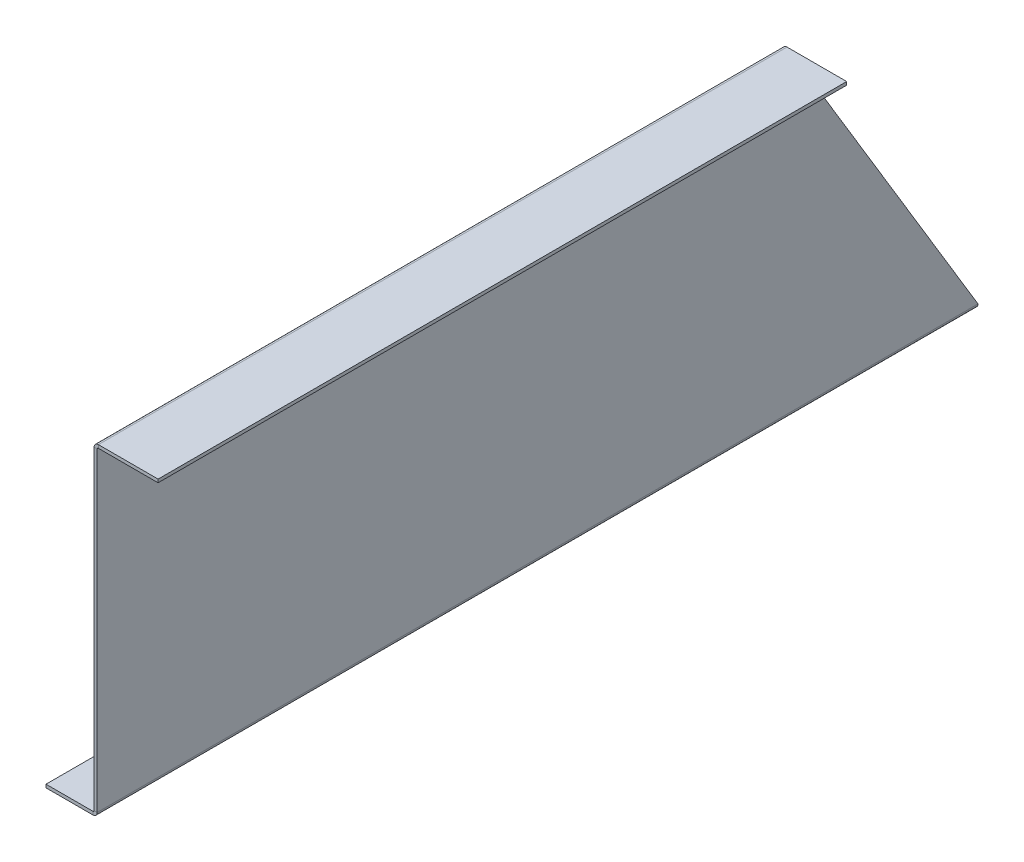
ISO-10303-21;
HEADER;
FILE_DESCRIPTION(('STEP AP214'),'2;1');
FILE_NAME('part.step','',(''),(''),'','','');
FILE_SCHEMA(('AUTOMOTIVE_DESIGN { 1 0 10303 214 1 1 1 1 }'));
ENDSEC;
DATA;
#1=APPLICATION_CONTEXT('core data for automotive mechanical design processes');
#2=APPLICATION_PROTOCOL_DEFINITION('international standard','automotive_design',2000,#1);
#3=PRODUCT_CONTEXT('',#1,'mechanical');
#4=PRODUCT('Part','Part','',(#3));
#5=PRODUCT_RELATED_PRODUCT_CATEGORY('part','',(#4));
#6=PRODUCT_DEFINITION_FORMATION('','',#4);
#7=PRODUCT_DEFINITION_CONTEXT('part definition',#1,'design');
#8=PRODUCT_DEFINITION('design','',#6,#7);
#9=PRODUCT_DEFINITION_SHAPE('','',#8);
#10=(LENGTH_UNIT() NAMED_UNIT(*) SI_UNIT(.MILLI.,.METRE.));
#11=(NAMED_UNIT(*) PLANE_ANGLE_UNIT() SI_UNIT($,.RADIAN.));
#12=(NAMED_UNIT(*) SI_UNIT($,.STERADIAN.) SOLID_ANGLE_UNIT());
#13=UNCERTAINTY_MEASURE_WITH_UNIT(LENGTH_MEASURE(1.E-05),#10,'distance_accuracy_value','');
#14=(GEOMETRIC_REPRESENTATION_CONTEXT(3) GLOBAL_UNCERTAINTY_ASSIGNED_CONTEXT((#13)) GLOBAL_UNIT_ASSIGNED_CONTEXT((#10,
#11,#12)) REPRESENTATION_CONTEXT('',''));
#15=CARTESIAN_POINT('',(0.,0.,0.));
#16=DIRECTION('',(0.,0.,1.));
#17=DIRECTION('',(1.,0.,0.));
#18=AXIS2_PLACEMENT_3D('',#15,#16,#17);
#19=CARTESIAN_POINT('',(29.2634,-2.,550.));
#20=DIRECTION('',(0.,0.,1.));
#21=DIRECTION('',(1.,0.,0.));
#22=AXIS2_PLACEMENT_3D('',#19,#20,#21);
#23=PLANE('',#22);
#24=DIRECTION('',(0.,1.,0.));
#25=VECTOR('',#24,1.);
#26=CARTESIAN_POINT('',(32.,0.,550.));
#27=LINE('',#26,#25);
#28=CARTESIAN_POINT('',(32.,0.7366,550.));
#29=VERTEX_POINT('',#28);
#30=CARTESIAN_POINT('',(32.,197.2634,550.));
#31=VERTEX_POINT('',#30);
#32=EDGE_CURVE('E253',#29,#31,#27,.T.);
#33=ORIENTED_EDGE('',*,*,#32,.T.);
#34=DIRECTION('',(-1.,0.,0.));
#35=VECTOR('',#34,1.);
#36=CARTESIAN_POINT('',(32.,197.2634,550.));
#37=LINE('',#36,#35);
#38=CARTESIAN_POINT('',(30.,197.2634,550.));
#39=VERTEX_POINT('',#38);
#40=EDGE_CURVE('E215',#31,#39,#37,.T.);
#41=ORIENTED_EDGE('',*,*,#40,.T.);
#42=DIRECTION('',(0.,1.,0.));
#43=VECTOR('',#42,1.);
#44=CARTESIAN_POINT('',(30.,0.,550.));
#45=LINE('',#44,#43);
#46=CARTESIAN_POINT('',(30.,0.7366,550.));
#47=VERTEX_POINT('',#46);
#48=EDGE_CURVE('E256',#47,#39,#45,.T.);
#49=ORIENTED_EDGE('',*,*,#48,.F.);
#50=DIRECTION('',(1.,0.,0.));
#51=VECTOR('',#50,1.);
#52=CARTESIAN_POINT('',(30.,0.7366,550.));
#53=LINE('',#52,#51);
#54=EDGE_CURVE('E311',#47,#29,#53,.T.);
#55=ORIENTED_EDGE('',*,*,#54,.T.);
#56=EDGE_LOOP('',(#33,#41,#49,#55));
#57=FACE_BOUND('',#56,.T.);
#58=ADVANCED_FACE('F59',(#57),#23,.T.);
#59=CARTESIAN_POINT('',(32.,0.,550.));
#60=DIRECTION('',(-1.,0.,0.));
#61=DIRECTION('',(0.,0.,1.));
#62=AXIS2_PLACEMENT_3D('',#59,#60,#61);
#63=PLANE('',#62);
#64=DIRECTION('',(0.,0.,1.));
#65=VECTOR('',#64,1.);
#66=CARTESIAN_POINT('',(32.,197.2634,550.));
#67=LINE('',#66,#65);
#68=CARTESIAN_POINT('',(32.,197.2634,120.));
#69=VERTEX_POINT('',#68);
#70=EDGE_CURVE('E221',#31,#69,#67,.F.);
#71=ORIENTED_EDGE('',*,*,#70,.F.);
#72=ORIENTED_EDGE('',*,*,#32,.F.);
#73=DIRECTION('',(0.,0.,-1.));
#74=VECTOR('',#73,1.);
#75=CARTESIAN_POINT('',(32.,0.7366,550.));
#76=LINE('',#75,#74);
#77=CARTESIAN_POINT('',(32.,0.7366,0.));
#78=VERTEX_POINT('',#77);
#79=EDGE_CURVE('E275',#29,#78,#76,.T.);
#80=ORIENTED_EDGE('',*,*,#79,.T.);
#81=DIRECTION('',(0.,-0.856653538721416,-0.515892154036165));
#82=VECTOR('',#81,1.);
#83=CARTESIAN_POINT('',(32.,0.7366,0.));
#84=LINE('',#83,#82);
#85=CARTESIAN_POINT('',(32.,198.339471666667,119.));
#86=VERTEX_POINT('',#85);
#87=EDGE_CURVE('E250',#86,#78,#84,.T.);
#88=ORIENTED_EDGE('',*,*,#87,.F.);
#89=DIRECTION('',(0.,1.,0.));
#90=VECTOR('',#89,1.);
#91=CARTESIAN_POINT('',(32.,196.2634,119.));
#92=LINE('',#91,#90);
#93=CARTESIAN_POINT('',(32.,196.2634,119.));
#94=VERTEX_POINT('',#93);
#95=EDGE_CURVE('E79',#94,#86,#92,.T.);
#96=ORIENTED_EDGE('',*,*,#95,.F.);
#97=DIRECTION('',(0.,0.,-1.));
#98=VECTOR('',#97,1.);
#99=CARTESIAN_POINT('',(32.,196.2634,120.));
#100=LINE('',#99,#98);
#101=CARTESIAN_POINT('',(32.,196.2634,120.));
#102=VERTEX_POINT('',#101);
#103=EDGE_CURVE('E74',#102,#94,#100,.T.);
#104=ORIENTED_EDGE('',*,*,#103,.F.);
#105=DIRECTION('',(0.,-1.,0.));
#106=VECTOR('',#105,1.);
#107=CARTESIAN_POINT('',(32.,197.2634,120.));
#108=LINE('',#107,#106);
#109=EDGE_CURVE('E232',#69,#102,#108,.T.);
#110=ORIENTED_EDGE('',*,*,#109,.F.);
#111=EDGE_LOOP('',(#71,#72,#80,#88,#96,#104,#110));
#112=FACE_BOUND('',#111,.T.);
#113=ADVANCED_FACE('F325',(#112),#63,.F.);
#114=CARTESIAN_POINT('',(30.,0.,550.));
#115=DIRECTION('',(-1.,0.,0.));
#116=DIRECTION('',(0.,0.,1.));
#117=AXIS2_PLACEMENT_3D('',#114,#115,#116);
#118=PLANE('',#117);
#119=ORIENTED_EDGE('',*,*,#48,.T.);
#120=DIRECTION('',(0.,0.,1.));
#121=VECTOR('',#120,1.);
#122=CARTESIAN_POINT('',(30.,197.2634,550.));
#123=LINE('',#122,#121);
#124=CARTESIAN_POINT('',(30.,197.2634,120.));
#125=VERTEX_POINT('',#124);
#126=EDGE_CURVE('E208',#39,#125,#123,.F.);
#127=ORIENTED_EDGE('',*,*,#126,.T.);
#128=DIRECTION('',(0.,-1.,0.));
#129=VECTOR('',#128,1.);
#130=CARTESIAN_POINT('',(30.,0.,120.));
#131=LINE('',#130,#129);
#132=CARTESIAN_POINT('',(30.,196.2634,120.));
#133=VERTEX_POINT('',#132);
#134=EDGE_CURVE('E13',#125,#133,#131,.T.);
#135=ORIENTED_EDGE('',*,*,#134,.T.);
#136=DIRECTION('',(0.,0.,-1.));
#137=VECTOR('',#136,1.);
#138=CARTESIAN_POINT('',(30.,196.2634,550.));
#139=LINE('',#138,#137);
#140=CARTESIAN_POINT('',(30.,196.2634,119.));
#141=VERTEX_POINT('',#140);
#142=EDGE_CURVE('E67',#133,#141,#139,.T.);
#143=ORIENTED_EDGE('',*,*,#142,.T.);
#144=DIRECTION('',(0.,1.,0.));
#145=VECTOR('',#144,1.);
#146=CARTESIAN_POINT('',(30.,0.,119.));
#147=LINE('',#146,#145);
#148=CARTESIAN_POINT('',(30.,198.339471666667,119.));
#149=VERTEX_POINT('',#148);
#150=EDGE_CURVE('E235',#141,#149,#147,.T.);
#151=ORIENTED_EDGE('',*,*,#150,.T.);
#152=DIRECTION('',(0.,-0.856653538721417,-0.515892154036165));
#153=VECTOR('',#152,1.);
#154=CARTESIAN_POINT('',(30.,0.7366,0.));
#155=LINE('',#154,#153);
#156=CARTESIAN_POINT('',(30.,0.7366,0.));
#157=VERTEX_POINT('',#156);
#158=EDGE_CURVE('E248',#149,#157,#155,.T.);
#159=ORIENTED_EDGE('',*,*,#158,.T.);
#160=DIRECTION('',(0.,0.,-1.));
#161=VECTOR('',#160,1.);
#162=CARTESIAN_POINT('',(30.,0.7366,550.));
#163=LINE('',#162,#161);
#164=EDGE_CURVE('E301',#47,#157,#163,.T.);
#165=ORIENTED_EDGE('',*,*,#164,.F.);
#166=EDGE_LOOP('',(#119,#127,#135,#143,#151,#159,#165));
#167=FACE_BOUND('',#166,.T.);
#168=ADVANCED_FACE('F315',(#167),#118,.T.);
#169=CARTESIAN_POINT('',(-0.001000000000001,0.7366,0.));
#170=DIRECTION('',(0.,-0.515892154036165,0.856653538721417));
#171=DIRECTION('',(0.,-0.856653538721417,-0.515892154036165));
#172=AXIS2_PLACEMENT_3D('',#169,#170,#171);
#173=PLANE('',#172);
#174=DIRECTION('',(-1.,0.,0.));
#175=VECTOR('',#174,1.);
#176=CARTESIAN_POINT('',(32.,198.339471666667,119.));
#177=LINE('',#176,#175);
#178=EDGE_CURVE('E239',#86,#149,#177,.T.);
#179=ORIENTED_EDGE('',*,*,#178,.F.);
#180=ORIENTED_EDGE('',*,*,#87,.T.);
#181=DIRECTION('',(-1.,0.,0.));
#182=VECTOR('',#181,1.);
#183=CARTESIAN_POINT('',(32.,0.7366,0.));
#184=LINE('',#183,#182);
#185=EDGE_CURVE('E304',#78,#157,#184,.T.);
#186=ORIENTED_EDGE('',*,*,#185,.T.);
#187=ORIENTED_EDGE('',*,*,#158,.F.);
#188=EDGE_LOOP('',(#179,#180,#186,#187));
#189=FACE_BOUND('',#188,.T.);
#190=ADVANCED_FACE('F341',(#189),#173,.F.);
#191=CARTESIAN_POINT('',(30.,0.7366,550.));
#192=DIRECTION('',(0.,0.,1.));
#193=DIRECTION('',(1.,0.,0.));
#194=AXIS2_PLACEMENT_3D('',#191,#192,#193);
#195=PLANE('',#194);
#196=ORIENTED_EDGE('',*,*,#54,.F.);
#197=CARTESIAN_POINT('',(29.2634,0.7366,550.));
#198=DIRECTION('',(0.,0.,-1.));
#199=DIRECTION('',(-1.,0.,0.));
#200=AXIS2_PLACEMENT_3D('',#197,#198,#199);
#201=CIRCLE('',#200,0.7366);
#202=CARTESIAN_POINT('',(29.2634,0.,550.));
#203=VERTEX_POINT('',#202);
#204=EDGE_CURVE('E260',#203,#47,#201,.F.);
#205=ORIENTED_EDGE('',*,*,#204,.F.);
#206=DIRECTION('',(0.,1.,0.));
#207=VECTOR('',#206,1.);
#208=CARTESIAN_POINT('',(29.2634,-2.,550.));
#209=LINE('',#208,#207);
#210=CARTESIAN_POINT('',(29.2634,-2.,550.));
#211=VERTEX_POINT('',#210);
#212=EDGE_CURVE('E309',#211,#203,#209,.T.);
#213=ORIENTED_EDGE('',*,*,#212,.F.);
#214=CARTESIAN_POINT('',(29.2634,0.7366,550.));
#215=DIRECTION('',(0.,0.,1.));
#216=DIRECTION('',(1.,0.,0.));
#217=AXIS2_PLACEMENT_3D('',#214,#215,#216);
#218=CIRCLE('',#217,2.7366);
#219=EDGE_CURVE('E272',#211,#29,#218,.T.);
#220=ORIENTED_EDGE('',*,*,#219,.T.);
#221=EDGE_LOOP('',(#196,#205,#213,#220));
#222=FACE_BOUND('',#221,.T.);
#223=ADVANCED_FACE('F61',(#222),#195,.T.);
#224=CARTESIAN_POINT('',(29.2634,0.,0.));
#225=DIRECTION('',(0.,0.,-1.));
#226=DIRECTION('',(-1.,0.,0.));
#227=AXIS2_PLACEMENT_3D('',#224,#225,#226);
#228=PLANE('',#227);
#229=DIRECTION('',(0.,-1.,0.));
#230=VECTOR('',#229,1.);
#231=CARTESIAN_POINT('',(29.2634,0.,0.));
#232=LINE('',#231,#230);
#233=CARTESIAN_POINT('',(29.2634,0.,0.));
#234=VERTEX_POINT('',#233);
#235=CARTESIAN_POINT('',(29.2634,-2.,0.));
#236=VERTEX_POINT('',#235);
#237=EDGE_CURVE('E307',#234,#236,#232,.T.);
#238=ORIENTED_EDGE('',*,*,#237,.F.);
#239=CARTESIAN_POINT('',(29.2634,0.7366,0.));
#240=DIRECTION('',(0.,0.,-1.));
#241=DIRECTION('',(-1.,0.,0.));
#242=AXIS2_PLACEMENT_3D('',#239,#240,#241);
#243=CIRCLE('',#242,0.7366);
#244=EDGE_CURVE('E252',#234,#157,#243,.F.);
#245=ORIENTED_EDGE('',*,*,#244,.T.);
#246=ORIENTED_EDGE('',*,*,#185,.F.);
#247=CARTESIAN_POINT('',(29.2634,0.7366,0.));
#248=DIRECTION('',(0.,0.,1.));
#249=DIRECTION('',(1.,0.,0.));
#250=AXIS2_PLACEMENT_3D('',#247,#248,#249);
#251=CIRCLE('',#250,2.7366);
#252=EDGE_CURVE('E257',#236,#78,#251,.T.);
#253=ORIENTED_EDGE('',*,*,#252,.F.);
#254=EDGE_LOOP('',(#238,#245,#246,#253));
#255=FACE_BOUND('',#254,.T.);
#256=ADVANCED_FACE('F343',(#255),#228,.T.);
#257=CARTESIAN_POINT('',(32.,0.7366,0.));
#258=DIRECTION('',(0.,0.,-1.));
#259=DIRECTION('',(-1.,0.,0.));
#260=AXIS2_PLACEMENT_3D('',#257,#258,#259);
#261=PLANE('',#260);
#262=DIRECTION('',(1.,0.,0.));
#263=VECTOR('',#262,1.);
#264=CARTESIAN_POINT('',(0.,0.,0.));
#265=LINE('',#264,#263);
#266=CARTESIAN_POINT('',(0.,0.,0.));
#267=VERTEX_POINT('',#266);
#268=EDGE_CURVE('E278',#267,#234,#265,.T.);
#269=ORIENTED_EDGE('',*,*,#268,.T.);
#270=ORIENTED_EDGE('',*,*,#237,.T.);
#271=DIRECTION('',(1.,0.,0.));
#272=VECTOR('',#271,1.);
#273=CARTESIAN_POINT('',(0.,-2.,0.));
#274=LINE('',#273,#272);
#275=CARTESIAN_POINT('',(0.,-2.,0.));
#276=VERTEX_POINT('',#275);
#277=EDGE_CURVE('E284',#276,#236,#274,.T.);
#278=ORIENTED_EDGE('',*,*,#277,.F.);
#279=DIRECTION('',(0.,1.,0.));
#280=VECTOR('',#279,1.);
#281=CARTESIAN_POINT('',(0.,-2.,0.));
#282=LINE('',#281,#280);
#283=EDGE_CURVE('E281',#276,#267,#282,.T.);
#284=ORIENTED_EDGE('',*,*,#283,.T.);
#285=EDGE_LOOP('',(#269,#270,#278,#284));
#286=FACE_BOUND('',#285,.T.);
#287=ADVANCED_FACE('F350',(#286),#261,.T.);
#288=CARTESIAN_POINT('',(29.2634,0.7366,550.));
#289=DIRECTION('',(0.,0.,-1.));
#290=DIRECTION('',(-1.,0.,0.));
#291=AXIS2_PLACEMENT_3D('',#288,#289,#290);
#292=CYLINDRICAL_SURFACE('',#291,0.7366);
#293=ORIENTED_EDGE('',*,*,#244,.F.);
#294=DIRECTION('',(0.,0.,-1.));
#295=VECTOR('',#294,1.);
#296=CARTESIAN_POINT('',(29.2634,0.,550.));
#297=LINE('',#296,#295);
#298=EDGE_CURVE('E298',#203,#234,#297,.T.);
#299=ORIENTED_EDGE('',*,*,#298,.F.);
#300=ORIENTED_EDGE('',*,*,#204,.T.);
#301=ORIENTED_EDGE('',*,*,#164,.T.);
#302=EDGE_LOOP('',(#293,#299,#300,#301));
#303=FACE_BOUND('',#302,.T.);
#304=ADVANCED_FACE('F347',(#303),#292,.F.);
#305=CARTESIAN_POINT('',(0.,0.,550.));
#306=DIRECTION('',(0.,1.,0.));
#307=DIRECTION('',(0.,0.,1.));
#308=AXIS2_PLACEMENT_3D('',#305,#306,#307);
#309=PLANE('',#308);
#310=ORIENTED_EDGE('',*,*,#268,.F.);
#311=DIRECTION('',(0.,0.,-1.));
#312=VECTOR('',#311,1.);
#313=CARTESIAN_POINT('',(0.,0.,550.));
#314=LINE('',#313,#312);
#315=CARTESIAN_POINT('',(0.,0.,550.));
#316=VERTEX_POINT('',#315);
#317=EDGE_CURVE('E296',#316,#267,#314,.T.);
#318=ORIENTED_EDGE('',*,*,#317,.F.);
#319=DIRECTION('',(1.,0.,0.));
#320=VECTOR('',#319,1.);
#321=CARTESIAN_POINT('',(0.,0.,550.));
#322=LINE('',#321,#320);
#323=EDGE_CURVE('E263',#316,#203,#322,.T.);
#324=ORIENTED_EDGE('',*,*,#323,.T.);
#325=ORIENTED_EDGE('',*,*,#298,.T.);
#326=EDGE_LOOP('',(#310,#318,#324,#325));
#327=FACE_BOUND('',#326,.T.);
#328=ADVANCED_FACE('F354',(#327),#309,.T.);
#329=CARTESIAN_POINT('',(0.,-2.,550.));
#330=DIRECTION('',(-1.,0.,0.));
#331=DIRECTION('',(0.,0.,1.));
#332=AXIS2_PLACEMENT_3D('',#329,#330,#331);
#333=PLANE('',#332);
#334=ORIENTED_EDGE('',*,*,#283,.F.);
#335=DIRECTION('',(0.,0.,-1.));
#336=VECTOR('',#335,1.);
#337=CARTESIAN_POINT('',(0.,-2.,550.));
#338=LINE('',#337,#336);
#339=CARTESIAN_POINT('',(0.,-2.,550.));
#340=VERTEX_POINT('',#339);
#341=EDGE_CURVE('E294',#340,#276,#338,.T.);
#342=ORIENTED_EDGE('',*,*,#341,.F.);
#343=DIRECTION('',(0.,1.,0.));
#344=VECTOR('',#343,1.);
#345=CARTESIAN_POINT('',(0.,-2.,550.));
#346=LINE('',#345,#344);
#347=EDGE_CURVE('E266',#340,#316,#346,.T.);
#348=ORIENTED_EDGE('',*,*,#347,.T.);
#349=ORIENTED_EDGE('',*,*,#317,.T.);
#350=EDGE_LOOP('',(#334,#342,#348,#349));
#351=FACE_BOUND('',#350,.T.);
#352=ADVANCED_FACE('F360',(#351),#333,.T.);
#353=CARTESIAN_POINT('',(0.,-2.,550.));
#354=DIRECTION('',(0.,1.,0.));
#355=DIRECTION('',(0.,0.,1.));
#356=AXIS2_PLACEMENT_3D('',#353,#354,#355);
#357=PLANE('',#356);
#358=ORIENTED_EDGE('',*,*,#277,.T.);
#359=DIRECTION('',(0.,0.,-1.));
#360=VECTOR('',#359,1.);
#361=CARTESIAN_POINT('',(29.2634,-2.,550.));
#362=LINE('',#361,#360);
#363=EDGE_CURVE('E291',#211,#236,#362,.T.);
#364=ORIENTED_EDGE('',*,*,#363,.F.);
#365=DIRECTION('',(1.,0.,0.));
#366=VECTOR('',#365,1.);
#367=CARTESIAN_POINT('',(0.,-2.,550.));
#368=LINE('',#367,#366);
#369=EDGE_CURVE('E269',#340,#211,#368,.T.);
#370=ORIENTED_EDGE('',*,*,#369,.F.);
#371=ORIENTED_EDGE('',*,*,#341,.T.);
#372=EDGE_LOOP('',(#358,#364,#370,#371));
#373=FACE_BOUND('',#372,.T.);
#374=ADVANCED_FACE('F364',(#373),#357,.F.);
#375=CARTESIAN_POINT('',(29.2634,0.7366,550.));
#376=DIRECTION('',(0.,0.,-1.));
#377=DIRECTION('',(-1.,0.,0.));
#378=AXIS2_PLACEMENT_3D('',#375,#376,#377);
#379=CYLINDRICAL_SURFACE('',#378,2.7366);
#380=ORIENTED_EDGE('',*,*,#252,.T.);
#381=ORIENTED_EDGE('',*,*,#79,.F.);
#382=ORIENTED_EDGE('',*,*,#219,.F.);
#383=ORIENTED_EDGE('',*,*,#363,.T.);
#384=EDGE_LOOP('',(#380,#381,#382,#383));
#385=FACE_BOUND('',#384,.T.);
#386=ADVANCED_FACE('F337',(#385),#379,.T.);
#387=CARTESIAN_POINT('',(29.2634,0.7366,550.));
#388=DIRECTION('',(0.,0.,-1.));
#389=DIRECTION('',(-1.,0.,0.));
#390=AXIS2_PLACEMENT_3D('',#387,#388,#389);
#391=PLANE('',#390);
#392=ORIENTED_EDGE('',*,*,#369,.T.);
#393=ORIENTED_EDGE('',*,*,#212,.T.);
#394=ORIENTED_EDGE('',*,*,#323,.F.);
#395=ORIENTED_EDGE('',*,*,#347,.F.);
#396=EDGE_LOOP('',(#392,#393,#394,#395));
#397=FACE_BOUND('',#396,.T.);
#398=ADVANCED_FACE('F358',(#397),#391,.F.);
#399=CARTESIAN_POINT('',(32.,197.2634,120.));
#400=DIRECTION('',(0.,0.,-1.));
#401=DIRECTION('',(-1.,0.,0.));
#402=AXIS2_PLACEMENT_3D('',#399,#400,#401);
#403=PLANE('',#402);
#404=ORIENTED_EDGE('',*,*,#134,.F.);
#405=DIRECTION('',(-1.,0.,0.));
#406=VECTOR('',#405,1.);
#407=CARTESIAN_POINT('',(32.,197.2634,120.));
#408=LINE('',#407,#406);
#409=EDGE_CURVE('E226',#69,#125,#408,.T.);
#410=ORIENTED_EDGE('',*,*,#409,.F.);
#411=ORIENTED_EDGE('',*,*,#109,.T.);
#412=DIRECTION('',(-1.,0.,0.));
#413=VECTOR('',#412,1.);
#414=CARTESIAN_POINT('',(32.,196.2634,120.));
#415=LINE('',#414,#413);
#416=EDGE_CURVE('E237',#102,#133,#415,.T.);
#417=ORIENTED_EDGE('',*,*,#416,.T.);
#418=EDGE_LOOP('',(#404,#410,#411,#417));
#419=FACE_BOUND('',#418,.T.);
#420=ADVANCED_FACE('F323',(#419),#403,.T.);
#421=CARTESIAN_POINT('',(32.,196.2634,120.));
#422=DIRECTION('',(0.,1.,0.));
#423=DIRECTION('',(0.,0.,1.));
#424=AXIS2_PLACEMENT_3D('',#421,#422,#423);
#425=PLANE('',#424);
#426=ORIENTED_EDGE('',*,*,#142,.F.);
#427=ORIENTED_EDGE('',*,*,#416,.F.);
#428=ORIENTED_EDGE('',*,*,#103,.T.);
#429=DIRECTION('',(-1.,0.,0.));
#430=VECTOR('',#429,1.);
#431=CARTESIAN_POINT('',(32.,196.2634,119.));
#432=LINE('',#431,#430);
#433=EDGE_CURVE('E229',#94,#141,#432,.T.);
#434=ORIENTED_EDGE('',*,*,#433,.T.);
#435=EDGE_LOOP('',(#426,#427,#428,#434));
#436=FACE_BOUND('',#435,.T.);
#437=ADVANCED_FACE('F320',(#436),#425,.T.);
#438=CARTESIAN_POINT('',(32.,196.2634,119.));
#439=DIRECTION('',(0.,0.,1.));
#440=DIRECTION('',(1.,0.,0.));
#441=AXIS2_PLACEMENT_3D('',#438,#439,#440);
#442=PLANE('',#441);
#443=ORIENTED_EDGE('',*,*,#150,.F.);
#444=ORIENTED_EDGE('',*,*,#433,.F.);
#445=ORIENTED_EDGE('',*,*,#95,.T.);
#446=ORIENTED_EDGE('',*,*,#178,.T.);
#447=EDGE_LOOP('',(#443,#444,#445,#446));
#448=FACE_BOUND('',#447,.T.);
#449=ADVANCED_FACE('F319',(#448),#442,.T.);
#450=CARTESIAN_POINT('',(32.7366,197.2634,120.));
#451=DIRECTION('',(0.,0.,-1.));
#452=DIRECTION('',(-1.,0.,0.));
#453=AXIS2_PLACEMENT_3D('',#450,#451,#452);
#454=PLANE('',#453);
#455=DIRECTION('',(0.,-1.,0.));
#456=VECTOR('',#455,1.);
#457=CARTESIAN_POINT('',(32.7366,200.,120.));
#458=LINE('',#457,#456);
#459=CARTESIAN_POINT('',(32.7366,198.,120.));
#460=VERTEX_POINT('',#459);
#461=CARTESIAN_POINT('',(32.7366,200.,120.));
#462=VERTEX_POINT('',#461);
#463=EDGE_CURVE('E190',#460,#462,#458,.F.);
#464=ORIENTED_EDGE('',*,*,#463,.F.);
#465=CARTESIAN_POINT('',(32.7366,197.2634,120.));
#466=DIRECTION('',(0.,0.,1.));
#467=DIRECTION('',(1.,0.,0.));
#468=AXIS2_PLACEMENT_3D('',#465,#466,#467);
#469=CIRCLE('',#468,0.736600000000004);
#470=EDGE_CURVE('E218',#69,#460,#469,.F.);
#471=ORIENTED_EDGE('',*,*,#470,.F.);
#472=ORIENTED_EDGE('',*,*,#409,.T.);
#473=CARTESIAN_POINT('',(32.7366,197.2634,120.));
#474=DIRECTION('',(0.,0.,1.));
#475=DIRECTION('',(1.,0.,0.));
#476=AXIS2_PLACEMENT_3D('',#473,#474,#475);
#477=CIRCLE('',#476,2.7366);
#478=EDGE_CURVE('E211',#125,#462,#477,.F.);
#479=ORIENTED_EDGE('',*,*,#478,.T.);
#480=EDGE_LOOP('',(#464,#471,#472,#479));
#481=FACE_BOUND('',#480,.T.);
#482=ADVANCED_FACE('F481',(#481),#454,.T.);
#483=CARTESIAN_POINT('',(32.7366,197.2634,550.));
#484=DIRECTION('',(0.,0.,-1.));
#485=DIRECTION('',(-1.,0.,0.));
#486=AXIS2_PLACEMENT_3D('',#483,#484,#485);
#487=PLANE('',#486);
#488=CARTESIAN_POINT('',(32.7366,197.2634,550.));
#489=DIRECTION('',(0.,0.,1.));
#490=DIRECTION('',(1.,0.,0.));
#491=AXIS2_PLACEMENT_3D('',#488,#489,#490);
#492=CIRCLE('',#491,0.736600000000004);
#493=CARTESIAN_POINT('',(32.7366,198.,550.));
#494=VERTEX_POINT('',#493);
#495=EDGE_CURVE('E223',#494,#31,#492,.T.);
#496=ORIENTED_EDGE('',*,*,#495,.F.);
#497=DIRECTION('',(0.,-1.,0.));
#498=VECTOR('',#497,1.);
#499=CARTESIAN_POINT('',(32.7366,198.,550.));
#500=LINE('',#499,#498);
#501=CARTESIAN_POINT('',(32.7366,200.,550.));
#502=VERTEX_POINT('',#501);
#503=EDGE_CURVE('E202',#494,#502,#500,.F.);
#504=ORIENTED_EDGE('',*,*,#503,.T.);
#505=CARTESIAN_POINT('',(32.7366,197.2634,550.));
#506=DIRECTION('',(0.,0.,1.));
#507=DIRECTION('',(1.,0.,0.));
#508=AXIS2_PLACEMENT_3D('',#505,#506,#507);
#509=CIRCLE('',#508,2.7366);
#510=EDGE_CURVE('E212',#502,#39,#509,.T.);
#511=ORIENTED_EDGE('',*,*,#510,.T.);
#512=ORIENTED_EDGE('',*,*,#40,.F.);
#513=EDGE_LOOP('',(#496,#504,#511,#512));
#514=FACE_BOUND('',#513,.T.);
#515=ADVANCED_FACE('F504',(#514),#487,.F.);
#516=CARTESIAN_POINT('',(32.7366,197.2634,550.));
#517=DIRECTION('',(0.,0.,1.));
#518=DIRECTION('',(0.,1.,0.));
#519=AXIS2_PLACEMENT_3D('',#516,#517,#518);
#520=CYLINDRICAL_SURFACE('',#519,2.7366);
#521=ORIENTED_EDGE('',*,*,#126,.F.);
#522=ORIENTED_EDGE('',*,*,#510,.F.);
#523=DIRECTION('',(0.,0.,1.));
#524=VECTOR('',#523,1.);
#525=CARTESIAN_POINT('',(32.7366,200.,120.));
#526=LINE('',#525,#524);
#527=EDGE_CURVE('E200',#502,#462,#526,.F.);
#528=ORIENTED_EDGE('',*,*,#527,.T.);
#529=ORIENTED_EDGE('',*,*,#478,.F.);
#530=EDGE_LOOP('',(#521,#522,#528,#529));
#531=FACE_BOUND('',#530,.T.);
#532=ADVANCED_FACE('F514',(#531),#520,.T.);
#533=CARTESIAN_POINT('',(32.7366,197.2634,550.));
#534=DIRECTION('',(0.,0.,1.));
#535=DIRECTION('',(0.,1.,0.));
#536=AXIS2_PLACEMENT_3D('',#533,#534,#535);
#537=CYLINDRICAL_SURFACE('',#536,0.736600000000004);
#538=ORIENTED_EDGE('',*,*,#70,.T.);
#539=ORIENTED_EDGE('',*,*,#470,.T.);
#540=DIRECTION('',(0.,0.,1.));
#541=VECTOR('',#540,1.);
#542=CARTESIAN_POINT('',(32.7366,198.,120.));
#543=LINE('',#542,#541);
#544=EDGE_CURVE('E205',#460,#494,#543,.T.);
#545=ORIENTED_EDGE('',*,*,#544,.T.);
#546=ORIENTED_EDGE('',*,*,#495,.T.);
#547=EDGE_LOOP('',(#538,#539,#545,#546));
#548=FACE_BOUND('',#547,.T.);
#549=ADVANCED_FACE('F524',(#548),#537,.F.);
#550=CARTESIAN_POINT('',(70.,200.,550.));
#551=DIRECTION('',(0.,0.,-1.));
#552=DIRECTION('',(-1.,0.,0.));
#553=AXIS2_PLACEMENT_3D('',#550,#551,#552);
#554=PLANE('',#553);
#555=ORIENTED_EDGE('',*,*,#503,.F.);
#556=DIRECTION('',(-1.,0.,0.));
#557=VECTOR('',#556,1.);
#558=CARTESIAN_POINT('',(70.,198.,550.));
#559=LINE('',#558,#557);
#560=CARTESIAN_POINT('',(70.,198.,550.));
#561=VERTEX_POINT('',#560);
#562=EDGE_CURVE('E198',#494,#561,#559,.F.);
#563=ORIENTED_EDGE('',*,*,#562,.T.);
#564=DIRECTION('',(0.,-1.,0.));
#565=VECTOR('',#564,1.);
#566=CARTESIAN_POINT('',(70.,200.,550.));
#567=LINE('',#566,#565);
#568=CARTESIAN_POINT('',(70.,200.,550.));
#569=VERTEX_POINT('',#568);
#570=EDGE_CURVE('E186',#569,#561,#567,.T.);
#571=ORIENTED_EDGE('',*,*,#570,.F.);
#572=DIRECTION('',(1.,0.,0.));
#573=VECTOR('',#572,1.);
#574=CARTESIAN_POINT('',(-7.37392847299499E-13,200.,550.));
#575=LINE('',#574,#573);
#576=EDGE_CURVE('E173',#502,#569,#575,.T.);
#577=ORIENTED_EDGE('',*,*,#576,.F.);
#578=EDGE_LOOP('',(#555,#563,#571,#577));
#579=FACE_BOUND('',#578,.T.);
#580=ADVANCED_FACE('F534',(#579),#554,.F.);
#581=CARTESIAN_POINT('',(32.,200.,120.));
#582=DIRECTION('',(0.,0.,1.));
#583=DIRECTION('',(1.,0.,0.));
#584=AXIS2_PLACEMENT_3D('',#581,#582,#583);
#585=PLANE('',#584);
#586=ORIENTED_EDGE('',*,*,#463,.T.);
#587=DIRECTION('',(-1.,0.,0.));
#588=VECTOR('',#587,1.);
#589=CARTESIAN_POINT('',(-7.37392847299499E-13,200.,120.));
#590=LINE('',#589,#588);
#591=CARTESIAN_POINT('',(70.,200.,120.));
#592=VERTEX_POINT('',#591);
#593=EDGE_CURVE('E171',#592,#462,#590,.T.);
#594=ORIENTED_EDGE('',*,*,#593,.F.);
#595=DIRECTION('',(0.,-1.,0.));
#596=VECTOR('',#595,1.);
#597=CARTESIAN_POINT('',(70.,200.,120.));
#598=LINE('',#597,#596);
#599=CARTESIAN_POINT('',(70.,198.,120.));
#600=VERTEX_POINT('',#599);
#601=EDGE_CURVE('E179',#592,#600,#598,.T.);
#602=ORIENTED_EDGE('',*,*,#601,.T.);
#603=DIRECTION('',(1.,0.,0.));
#604=VECTOR('',#603,1.);
#605=CARTESIAN_POINT('',(32.,198.,120.));
#606=LINE('',#605,#604);
#607=EDGE_CURVE('E195',#600,#460,#606,.F.);
#608=ORIENTED_EDGE('',*,*,#607,.T.);
#609=EDGE_LOOP('',(#586,#594,#602,#608));
#610=FACE_BOUND('',#609,.T.);
#611=ADVANCED_FACE('F189',(#610),#585,.F.);
#612=CARTESIAN_POINT('',(-7.37392847299499E-13,200.,0.));
#613=DIRECTION('',(0.,-1.,0.));
#614=DIRECTION('',(1.,0.,0.));
#615=AXIS2_PLACEMENT_3D('',#612,#613,#614);
#616=PLANE('',#615);
#617=ORIENTED_EDGE('',*,*,#527,.F.);
#618=ORIENTED_EDGE('',*,*,#576,.T.);
#619=DIRECTION('',(0.,0.,-1.));
#620=VECTOR('',#619,1.);
#621=CARTESIAN_POINT('',(70.,200.,0.));
#622=LINE('',#621,#620);
#623=EDGE_CURVE('E166',#569,#592,#622,.T.);
#624=ORIENTED_EDGE('',*,*,#623,.T.);
#625=ORIENTED_EDGE('',*,*,#593,.T.);
#626=EDGE_LOOP('',(#617,#618,#624,#625));
#627=FACE_BOUND('',#626,.T.);
#628=ADVANCED_FACE('F169',(#627),#616,.F.);
#629=CARTESIAN_POINT('',(-7.30409884621813E-13,198.,0.));
#630=DIRECTION('',(0.,-1.,0.));
#631=DIRECTION('',(1.,0.,0.));
#632=AXIS2_PLACEMENT_3D('',#629,#630,#631);
#633=PLANE('',#632);
#634=ORIENTED_EDGE('',*,*,#562,.F.);
#635=ORIENTED_EDGE('',*,*,#544,.F.);
#636=ORIENTED_EDGE('',*,*,#607,.F.);
#637=DIRECTION('',(0.,0.,1.));
#638=VECTOR('',#637,1.);
#639=CARTESIAN_POINT('',(70.,198.,120.));
#640=LINE('',#639,#638);
#641=EDGE_CURVE('E182',#561,#600,#640,.F.);
#642=ORIENTED_EDGE('',*,*,#641,.F.);
#643=EDGE_LOOP('',(#634,#635,#636,#642));
#644=FACE_BOUND('',#643,.T.);
#645=ADVANCED_FACE('F560',(#644),#633,.T.);
#646=CARTESIAN_POINT('',(70.,200.,120.));
#647=DIRECTION('',(-1.,0.,0.));
#648=DIRECTION('',(0.,-1.,0.));
#649=AXIS2_PLACEMENT_3D('',#646,#647,#648);
#650=PLANE('',#649);
#651=ORIENTED_EDGE('',*,*,#641,.T.);
#652=ORIENTED_EDGE('',*,*,#601,.F.);
#653=ORIENTED_EDGE('',*,*,#623,.F.);
#654=ORIENTED_EDGE('',*,*,#570,.T.);
#655=EDGE_LOOP('',(#651,#652,#653,#654));
#656=FACE_BOUND('',#655,.T.);
#657=ADVANCED_FACE('F180',(#656),#650,.F.);
#658=CLOSED_SHELL('',(#58,#113,#168,#190,#223,#256,#287,#304,#328,#352,#374,#386,#398,#420,#437,
#449,#482,#515,#532,#549,#580,#611,#628,#645,#657));
#659=MANIFOLD_SOLID_BREP('B2',#658);
#660=ADVANCED_BREP_SHAPE_REPRESENTATION('',(#18,#659),#14);
#661=SHAPE_DEFINITION_REPRESENTATION(#9,#660);
ENDSEC;
END-ISO-10303-21;
